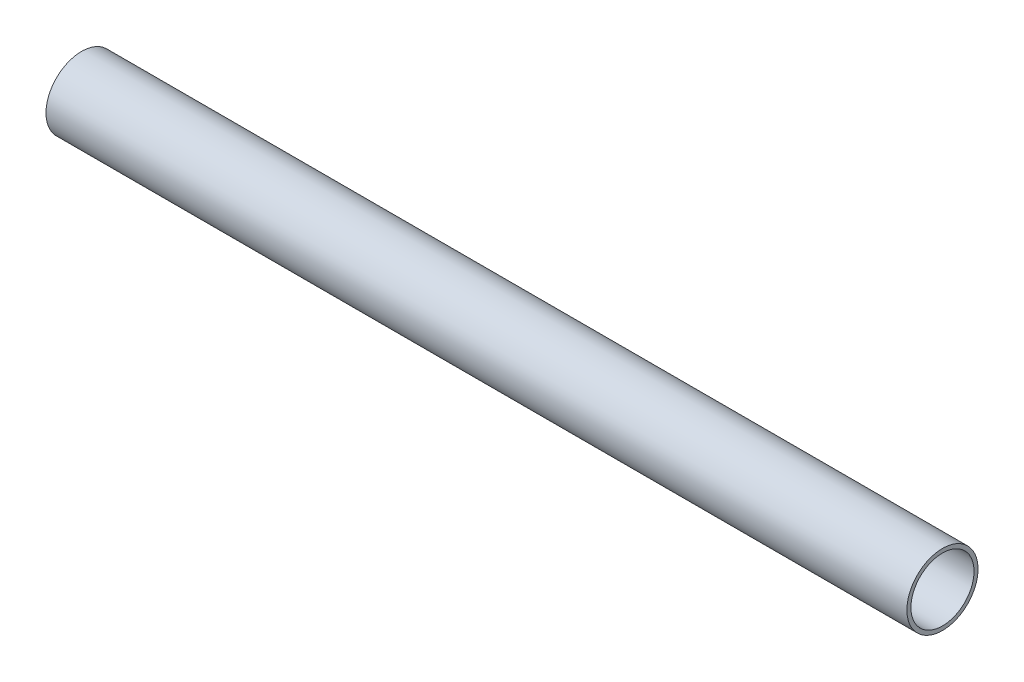
ISO-10303-21;
HEADER;
FILE_DESCRIPTION(('STEP AP214'),'2;1');
FILE_NAME('part.step','',(''),(''),'','','');
FILE_SCHEMA(('AUTOMOTIVE_DESIGN { 1 0 10303 214 1 1 1 1 }'));
ENDSEC;
DATA;
#1=APPLICATION_CONTEXT('core data for automotive mechanical design processes');
#2=APPLICATION_PROTOCOL_DEFINITION('international standard','automotive_design',2000,#1);
#3=PRODUCT_CONTEXT('',#1,'mechanical');
#4=PRODUCT('Part','Part','',(#3));
#5=PRODUCT_RELATED_PRODUCT_CATEGORY('part','',(#4));
#6=PRODUCT_DEFINITION_FORMATION('','',#4);
#7=PRODUCT_DEFINITION_CONTEXT('part definition',#1,'design');
#8=PRODUCT_DEFINITION('design','',#6,#7);
#9=PRODUCT_DEFINITION_SHAPE('','',#8);
#10=(LENGTH_UNIT() NAMED_UNIT(*) SI_UNIT(.MILLI.,.METRE.));
#11=(NAMED_UNIT(*) PLANE_ANGLE_UNIT() SI_UNIT($,.RADIAN.));
#12=(NAMED_UNIT(*) SI_UNIT($,.STERADIAN.) SOLID_ANGLE_UNIT());
#13=UNCERTAINTY_MEASURE_WITH_UNIT(LENGTH_MEASURE(1.E-05),#10,'distance_accuracy_value','');
#14=(GEOMETRIC_REPRESENTATION_CONTEXT(3) GLOBAL_UNCERTAINTY_ASSIGNED_CONTEXT((#13)) GLOBAL_UNIT_ASSIGNED_CONTEXT((#10,
#11,#12)) REPRESENTATION_CONTEXT('',''));
#15=CARTESIAN_POINT('',(0.,0.,0.));
#16=DIRECTION('',(0.,0.,1.));
#17=DIRECTION('',(1.,0.,0.));
#18=AXIS2_PLACEMENT_3D('',#15,#16,#17);
#19=CARTESIAN_POINT('',(38.1,0.,0.));
#20=DIRECTION('',(1.,0.,0.));
#21=DIRECTION('',(0.,0.,-1.));
#22=AXIS2_PLACEMENT_3D('',#19,#20,#21);
#23=PLANE('',#22);
#24=CARTESIAN_POINT('',(38.1,0.,0.));
#25=DIRECTION('',(1.,0.,0.));
#26=DIRECTION('',(0.,0.,-1.));
#27=AXIS2_PLACEMENT_3D('',#24,#25,#26);
#28=CIRCLE('',#27,1.5748);
#29=CARTESIAN_POINT('',(38.1,0.,1.5748));
#30=VERTEX_POINT('',#29);
#31=EDGE_CURVE('E10',#30,#30,#28,.T.);
#32=ORIENTED_EDGE('',*,*,#31,.T.);
#33=EDGE_LOOP('',(#32));
#34=FACE_BOUND('',#33,.T.);
#35=CARTESIAN_POINT('',(38.1,0.,0.));
#36=DIRECTION('',(1.,0.,0.));
#37=DIRECTION('',(0.,0.,-1.));
#38=AXIS2_PLACEMENT_3D('',#35,#36,#37);
#39=CIRCLE('',#38,1.397);
#40=CARTESIAN_POINT('',(38.1,0.,1.397));
#41=VERTEX_POINT('',#40);
#42=EDGE_CURVE('E50',#41,#41,#39,.T.);
#43=ORIENTED_EDGE('',*,*,#42,.F.);
#44=EDGE_LOOP('',(#43));
#45=FACE_BOUND('',#44,.T.);
#46=ADVANCED_FACE('F39',(#34,#45),#23,.T.);
#47=CARTESIAN_POINT('',(0.,0.,0.));
#48=DIRECTION('',(1.,0.,0.));
#49=DIRECTION('',(0.,0.,-1.));
#50=AXIS2_PLACEMENT_3D('',#47,#48,#49);
#51=PLANE('',#50);
#52=CARTESIAN_POINT('',(0.,0.,0.));
#53=DIRECTION('',(1.,0.,0.));
#54=DIRECTION('',(0.,0.,-1.));
#55=AXIS2_PLACEMENT_3D('',#52,#53,#54);
#56=CIRCLE('',#55,1.5748);
#57=CARTESIAN_POINT('',(0.,0.,1.5748));
#58=VERTEX_POINT('',#57);
#59=EDGE_CURVE('E43',#58,#58,#56,.T.);
#60=ORIENTED_EDGE('',*,*,#59,.F.);
#61=EDGE_LOOP('',(#60));
#62=FACE_BOUND('',#61,.T.);
#63=CARTESIAN_POINT('',(0.,0.,0.));
#64=DIRECTION('',(1.,0.,0.));
#65=DIRECTION('',(0.,0.,-1.));
#66=AXIS2_PLACEMENT_3D('',#63,#64,#65);
#67=CIRCLE('',#66,1.397);
#68=CARTESIAN_POINT('',(0.,0.,1.397));
#69=VERTEX_POINT('',#68);
#70=EDGE_CURVE('E52',#69,#69,#67,.T.);
#71=ORIENTED_EDGE('',*,*,#70,.T.);
#72=EDGE_LOOP('',(#71));
#73=FACE_BOUND('',#72,.T.);
#74=ADVANCED_FACE('F62',(#62,#73),#51,.F.);
#75=CARTESIAN_POINT('',(38.1,0.,0.));
#76=DIRECTION('',(-1.,0.,0.));
#77=DIRECTION('',(0.,0.,1.));
#78=AXIS2_PLACEMENT_3D('',#75,#76,#77);
#79=CYLINDRICAL_SURFACE('',#78,1.5748);
#80=CARTESIAN_POINT('',(38.1,0.,1.5748));
#81=CARTESIAN_POINT('',(37.703125,0.,1.5748));
#82=CARTESIAN_POINT('',(37.30625,0.,1.5748));
#83=CARTESIAN_POINT('',(36.5125,0.,1.5748));
#84=CARTESIAN_POINT('',(36.115625,0.,1.5748));
#85=CARTESIAN_POINT('',(35.321875,0.,1.5748));
#86=CARTESIAN_POINT('',(34.925,0.,1.5748));
#87=CARTESIAN_POINT('',(34.13125,0.,1.5748));
#88=CARTESIAN_POINT('',(33.734375,0.,1.5748));
#89=CARTESIAN_POINT('',(32.940625,0.,1.5748));
#90=CARTESIAN_POINT('',(32.54375,0.,1.5748));
#91=CARTESIAN_POINT('',(31.75,0.,1.5748));
#92=CARTESIAN_POINT('',(31.353125,0.,1.5748));
#93=CARTESIAN_POINT('',(30.559375,0.,1.5748));
#94=CARTESIAN_POINT('',(30.1625,0.,1.5748));
#95=CARTESIAN_POINT('',(29.36875,0.,1.5748));
#96=CARTESIAN_POINT('',(28.971875,0.,1.5748));
#97=CARTESIAN_POINT('',(28.178125,0.,1.5748));
#98=CARTESIAN_POINT('',(27.78125,0.,1.5748));
#99=CARTESIAN_POINT('',(26.9875,0.,1.5748));
#100=CARTESIAN_POINT('',(26.590625,0.,1.5748));
#101=CARTESIAN_POINT('',(25.796875,0.,1.5748));
#102=CARTESIAN_POINT('',(25.4,0.,1.5748));
#103=CARTESIAN_POINT('',(24.60625,0.,1.5748));
#104=CARTESIAN_POINT('',(24.209375,0.,1.5748));
#105=CARTESIAN_POINT('',(23.415625,0.,1.5748));
#106=CARTESIAN_POINT('',(23.01875,0.,1.5748));
#107=CARTESIAN_POINT('',(22.225,0.,1.5748));
#108=CARTESIAN_POINT('',(21.828125,0.,1.5748));
#109=CARTESIAN_POINT('',(21.034375,0.,1.5748));
#110=CARTESIAN_POINT('',(20.6375,0.,1.5748));
#111=CARTESIAN_POINT('',(19.84375,0.,1.5748));
#112=CARTESIAN_POINT('',(19.446875,0.,1.5748));
#113=CARTESIAN_POINT('',(18.653125,0.,1.5748));
#114=CARTESIAN_POINT('',(18.25625,0.,1.5748));
#115=CARTESIAN_POINT('',(17.4625,0.,1.5748));
#116=CARTESIAN_POINT('',(17.065625,0.,1.5748));
#117=CARTESIAN_POINT('',(16.271875,0.,1.5748));
#118=CARTESIAN_POINT('',(15.875,0.,1.5748));
#119=CARTESIAN_POINT('',(15.08125,0.,1.5748));
#120=CARTESIAN_POINT('',(14.684375,0.,1.5748));
#121=CARTESIAN_POINT('',(13.890625,0.,1.5748));
#122=CARTESIAN_POINT('',(13.49375,0.,1.5748));
#123=CARTESIAN_POINT('',(12.7,0.,1.5748));
#124=CARTESIAN_POINT('',(12.303125,0.,1.5748));
#125=CARTESIAN_POINT('',(11.509375,0.,1.5748));
#126=CARTESIAN_POINT('',(11.1125,0.,1.5748));
#127=CARTESIAN_POINT('',(10.31875,0.,1.5748));
#128=CARTESIAN_POINT('',(9.92187499999999,0.,1.5748));
#129=CARTESIAN_POINT('',(9.128125,0.,1.5748));
#130=CARTESIAN_POINT('',(8.73124999999999,0.,1.5748));
#131=CARTESIAN_POINT('',(7.93749999999999,0.,1.5748));
#132=CARTESIAN_POINT('',(7.54062499999999,0.,1.5748));
#133=CARTESIAN_POINT('',(6.746875,0.,1.5748));
#134=CARTESIAN_POINT('',(6.35,0.,1.5748));
#135=CARTESIAN_POINT('',(5.55625,0.,1.5748));
#136=CARTESIAN_POINT('',(5.159375,0.,1.5748));
#137=CARTESIAN_POINT('',(4.365625,0.,1.5748));
#138=CARTESIAN_POINT('',(3.96875,0.,1.5748));
#139=CARTESIAN_POINT('',(3.175,0.,1.5748));
#140=CARTESIAN_POINT('',(2.778125,0.,1.5748));
#141=CARTESIAN_POINT('',(1.984375,0.,1.5748));
#142=CARTESIAN_POINT('',(1.5875,0.,1.5748));
#143=CARTESIAN_POINT('',(0.79375,0.,1.5748));
#144=CARTESIAN_POINT('',(0.396875,0.,1.5748));
#145=CARTESIAN_POINT('',(0.,0.,1.5748));
#146=B_SPLINE_CURVE_WITH_KNOTS('',3,(#80,#81,#82,#83,#84,#85,#86,#87,#88,#89,#90,#91,#92,#93,
#94,#95,#96,#97,#98,#99,#100,#101,#102,#103,#104,#105,#106,#107,#108,#109,#110,#111,#112,#113,
#114,#115,#116,#117,#118,#119,#120,#121,#122,#123,#124,#125,#126,#127,#128,#129,#130,#131,#132,
#133,#134,#135,#136,#137,#138,#139,#140,#141,#142,#143,#144,#145),.UNSPECIFIED.,.F.,.F.,(4,2,2,
2,2,2,2,2,2,2,2,2,2,2,2,2,2,2,2,2,2,2,2,2,2,2,2,2,2,2,2,2,4),(0.,1.190625,2.38125,3.571875,
4.7625,5.953125,7.14375,8.334375,9.52500000000001,10.715625,11.90625,13.096875,14.2875,
15.478125,16.66875,17.859375,19.05,20.240625,21.43125,22.621875,23.8125,25.003125,26.19375,
27.384375,28.575,29.765625,30.95625,32.146875,33.3375,34.528125,35.71875,36.909375,38.1),.UNSPECIFIED.);
#147=EDGE_CURVE('BSEAM41',#30,#58,#146,.T.);
#148=ORIENTED_EDGE('',*,*,#31,.F.);
#149=ORIENTED_EDGE('',*,*,#59,.T.);
#150=ORIENTED_EDGE('',*,*,#147,.T.);
#151=ORIENTED_EDGE('',*,*,#147,.F.);
#152=EDGE_LOOP('',(#148,#150,#149,#151));
#153=FACE_BOUND('',#152,.T.);
#154=ADVANCED_FACE('F41',(#153),#79,.T.);
#155=CARTESIAN_POINT('',(38.1,0.,0.));
#156=DIRECTION('',(-1.,0.,0.));
#157=DIRECTION('',(0.,0.,1.));
#158=AXIS2_PLACEMENT_3D('',#155,#156,#157);
#159=CYLINDRICAL_SURFACE('',#158,1.397);
#160=CARTESIAN_POINT('',(38.1,0.,1.397));
#161=CARTESIAN_POINT('',(37.703125,0.,1.397));
#162=CARTESIAN_POINT('',(37.30625,0.,1.397));
#163=CARTESIAN_POINT('',(36.5125,0.,1.397));
#164=CARTESIAN_POINT('',(36.115625,0.,1.397));
#165=CARTESIAN_POINT('',(35.321875,0.,1.397));
#166=CARTESIAN_POINT('',(34.925,0.,1.397));
#167=CARTESIAN_POINT('',(34.13125,0.,1.397));
#168=CARTESIAN_POINT('',(33.734375,0.,1.397));
#169=CARTESIAN_POINT('',(32.940625,0.,1.397));
#170=CARTESIAN_POINT('',(32.54375,0.,1.397));
#171=CARTESIAN_POINT('',(31.75,0.,1.397));
#172=CARTESIAN_POINT('',(31.353125,0.,1.397));
#173=CARTESIAN_POINT('',(30.559375,0.,1.397));
#174=CARTESIAN_POINT('',(30.1625,0.,1.397));
#175=CARTESIAN_POINT('',(29.36875,0.,1.397));
#176=CARTESIAN_POINT('',(28.971875,0.,1.397));
#177=CARTESIAN_POINT('',(28.178125,0.,1.397));
#178=CARTESIAN_POINT('',(27.78125,0.,1.397));
#179=CARTESIAN_POINT('',(26.9875,0.,1.397));
#180=CARTESIAN_POINT('',(26.590625,0.,1.397));
#181=CARTESIAN_POINT('',(25.796875,0.,1.397));
#182=CARTESIAN_POINT('',(25.4,0.,1.397));
#183=CARTESIAN_POINT('',(24.60625,0.,1.397));
#184=CARTESIAN_POINT('',(24.209375,0.,1.397));
#185=CARTESIAN_POINT('',(23.415625,0.,1.397));
#186=CARTESIAN_POINT('',(23.01875,0.,1.397));
#187=CARTESIAN_POINT('',(22.225,0.,1.397));
#188=CARTESIAN_POINT('',(21.828125,0.,1.397));
#189=CARTESIAN_POINT('',(21.034375,0.,1.397));
#190=CARTESIAN_POINT('',(20.6375,0.,1.397));
#191=CARTESIAN_POINT('',(19.84375,0.,1.397));
#192=CARTESIAN_POINT('',(19.446875,0.,1.397));
#193=CARTESIAN_POINT('',(18.653125,0.,1.397));
#194=CARTESIAN_POINT('',(18.25625,0.,1.397));
#195=CARTESIAN_POINT('',(17.4625,0.,1.397));
#196=CARTESIAN_POINT('',(17.065625,0.,1.397));
#197=CARTESIAN_POINT('',(16.271875,0.,1.397));
#198=CARTESIAN_POINT('',(15.875,0.,1.397));
#199=CARTESIAN_POINT('',(15.08125,0.,1.397));
#200=CARTESIAN_POINT('',(14.684375,0.,1.397));
#201=CARTESIAN_POINT('',(13.890625,0.,1.397));
#202=CARTESIAN_POINT('',(13.49375,0.,1.397));
#203=CARTESIAN_POINT('',(12.7,0.,1.397));
#204=CARTESIAN_POINT('',(12.303125,0.,1.397));
#205=CARTESIAN_POINT('',(11.509375,0.,1.397));
#206=CARTESIAN_POINT('',(11.1125,0.,1.397));
#207=CARTESIAN_POINT('',(10.31875,0.,1.397));
#208=CARTESIAN_POINT('',(9.921875,0.,1.397));
#209=CARTESIAN_POINT('',(9.128125,0.,1.397));
#210=CARTESIAN_POINT('',(8.73125,0.,1.397));
#211=CARTESIAN_POINT('',(7.9375,0.,1.397));
#212=CARTESIAN_POINT('',(7.540625,0.,1.397));
#213=CARTESIAN_POINT('',(6.746875,0.,1.397));
#214=CARTESIAN_POINT('',(6.35,0.,1.397));
#215=CARTESIAN_POINT('',(5.55625,0.,1.397));
#216=CARTESIAN_POINT('',(5.159375,0.,1.397));
#217=CARTESIAN_POINT('',(4.365625,0.,1.397));
#218=CARTESIAN_POINT('',(3.96875,0.,1.397));
#219=CARTESIAN_POINT('',(3.175,0.,1.397));
#220=CARTESIAN_POINT('',(2.778125,0.,1.397));
#221=CARTESIAN_POINT('',(1.984375,0.,1.397));
#222=CARTESIAN_POINT('',(1.5875,0.,1.397));
#223=CARTESIAN_POINT('',(0.79375,0.,1.397));
#224=CARTESIAN_POINT('',(0.396875,0.,1.397));
#225=CARTESIAN_POINT('',(0.,0.,1.397));
#226=B_SPLINE_CURVE_WITH_KNOTS('',3,(#160,#161,#162,#163,#164,#165,#166,#167,#168,#169,#170,
#171,#172,#173,#174,#175,#176,#177,#178,#179,#180,#181,#182,#183,#184,#185,#186,#187,#188,#189,
#190,#191,#192,#193,#194,#195,#196,#197,#198,#199,#200,#201,#202,#203,#204,#205,#206,#207,#208,
#209,#210,#211,#212,#213,#214,#215,#216,#217,#218,#219,#220,#221,#222,#223,#224,#225),
.UNSPECIFIED.,.F.,.F.,(4,2,2,2,2,2,2,2,2,2,2,2,2,2,2,2,2,2,2,2,2,2,2,2,2,2,2,2,2,2,2,2,4),(0.,
1.19062499999999,2.38124999999999,3.571875,4.7625,5.953125,7.14375,8.33437499999999,9.525,
10.715625,11.90625,13.096875,14.2875,15.478125,16.66875,17.859375,19.05,20.240625,21.43125,
22.621875,23.8125,25.003125,26.19375,27.384375,28.575,29.765625,30.95625,32.146875,33.3375,
34.528125,35.71875,36.909375,38.1),.UNSPECIFIED.);
#227=EDGE_CURVE('BSEAM58',#41,#69,#226,.T.);
#228=ORIENTED_EDGE('',*,*,#42,.T.);
#229=ORIENTED_EDGE('',*,*,#70,.F.);
#230=ORIENTED_EDGE('',*,*,#227,.T.);
#231=ORIENTED_EDGE('',*,*,#227,.F.);
#232=EDGE_LOOP('',(#228,#230,#229,#231));
#233=FACE_BOUND('',#232,.T.);
#234=ADVANCED_FACE('F58',(#233),#159,.F.);
#235=CLOSED_SHELL('',(#46,#74,#154,#234));
#236=MANIFOLD_SOLID_BREP('B2',#235);
#237=ADVANCED_BREP_SHAPE_REPRESENTATION('',(#18,#236),#14);
#238=SHAPE_DEFINITION_REPRESENTATION(#9,#237);
ENDSEC;
END-ISO-10303-21;
